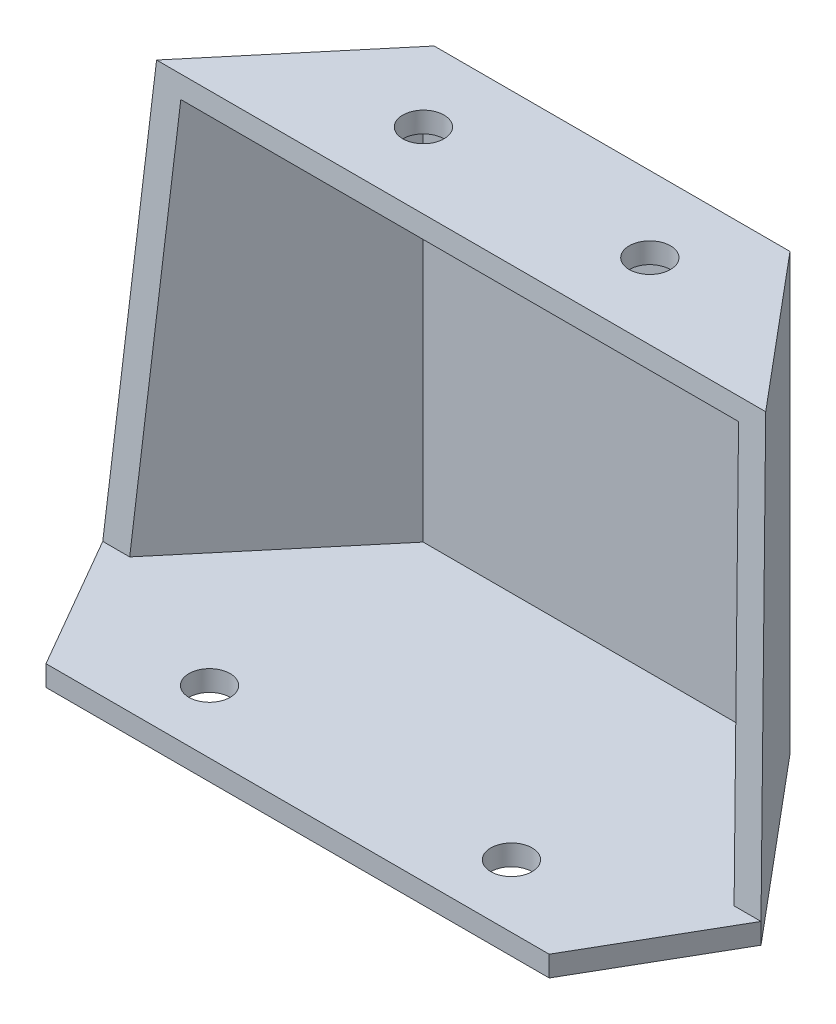
ISO-10303-21;
HEADER;
FILE_DESCRIPTION(('STEP AP214'),'2;1');
FILE_NAME('part.step','',(''),(''),'','','');
FILE_SCHEMA(('AUTOMOTIVE_DESIGN { 1 0 10303 214 1 1 1 1 }'));
ENDSEC;
DATA;
#1=APPLICATION_CONTEXT('core data for automotive mechanical design processes');
#2=APPLICATION_PROTOCOL_DEFINITION('international standard','automotive_design',2000,#1);
#3=PRODUCT_CONTEXT('',#1,'mechanical');
#4=PRODUCT('Part','Part','',(#3));
#5=PRODUCT_RELATED_PRODUCT_CATEGORY('part','',(#4));
#6=PRODUCT_DEFINITION_FORMATION('','',#4);
#7=PRODUCT_DEFINITION_CONTEXT('part definition',#1,'design');
#8=PRODUCT_DEFINITION('design','',#6,#7);
#9=PRODUCT_DEFINITION_SHAPE('','',#8);
#10=(LENGTH_UNIT() NAMED_UNIT(*) SI_UNIT(.MILLI.,.METRE.));
#11=(NAMED_UNIT(*) PLANE_ANGLE_UNIT() SI_UNIT($,.RADIAN.));
#12=(NAMED_UNIT(*) SI_UNIT($,.STERADIAN.) SOLID_ANGLE_UNIT());
#13=UNCERTAINTY_MEASURE_WITH_UNIT(LENGTH_MEASURE(1.E-05),#10,'distance_accuracy_value','');
#14=(GEOMETRIC_REPRESENTATION_CONTEXT(3) GLOBAL_UNCERTAINTY_ASSIGNED_CONTEXT((#13)) GLOBAL_UNIT_ASSIGNED_CONTEXT((#10,
#11,#12)) REPRESENTATION_CONTEXT('',''));
#15=CARTESIAN_POINT('',(0.,0.,0.));
#16=DIRECTION('',(0.,0.,1.));
#17=DIRECTION('',(1.,0.,0.));
#18=AXIS2_PLACEMENT_3D('',#15,#16,#17);
#19=CARTESIAN_POINT('',(86.265,211.,29.5161290322579));
#20=DIRECTION('',(0.,0.,1.));
#21=DIRECTION('',(1.,0.,0.));
#22=AXIS2_PLACEMENT_3D('',#19,#20,#21);
#23=PLANE('',#22);
#24=DIRECTION('',(-1.,0.,0.));
#25=VECTOR('',#24,1.);
#26=CARTESIAN_POINT('',(86.265,0.,29.5161290322579));
#27=LINE('',#26,#25);
#28=CARTESIAN_POINT('',(86.265,0.,29.5161290322579));
#29=VERTEX_POINT('',#28);
#30=CARTESIAN_POINT('',(-86.265,0.,29.5161290322579));
#31=VERTEX_POINT('',#30);
#32=EDGE_CURVE('E226',#29,#31,#27,.T.);
#33=ORIENTED_EDGE('',*,*,#32,.T.);
#34=DIRECTION('',(0.,-1.,0.));
#35=VECTOR('',#34,1.);
#36=CARTESIAN_POINT('',(-86.265,211.,29.5161290322579));
#37=LINE('',#36,#35);
#38=CARTESIAN_POINT('',(-86.265,211.,29.5161290322579));
#39=VERTEX_POINT('',#38);
#40=EDGE_CURVE('E178',#39,#31,#37,.T.);
#41=ORIENTED_EDGE('',*,*,#40,.F.);
#42=DIRECTION('',(-1.,0.,0.));
#43=VECTOR('',#42,1.);
#44=CARTESIAN_POINT('',(86.265,211.,29.5161290322579));
#45=LINE('',#44,#43);
#46=CARTESIAN_POINT('',(86.265,211.,29.5161290322579));
#47=VERTEX_POINT('',#46);
#48=EDGE_CURVE('E227',#47,#39,#45,.T.);
#49=ORIENTED_EDGE('',*,*,#48,.F.);
#50=DIRECTION('',(0.,-1.,0.));
#51=VECTOR('',#50,1.);
#52=CARTESIAN_POINT('',(86.265,211.,29.5161290322579));
#53=LINE('',#52,#51);
#54=EDGE_CURVE('E163',#47,#29,#53,.T.);
#55=ORIENTED_EDGE('',*,*,#54,.T.);
#56=EDGE_LOOP('',(#33,#41,#49,#55));
#57=FACE_BOUND('',#56,.T.);
#58=ADVANCED_FACE('F43',(#57),#23,.F.);
#59=CARTESIAN_POINT('',(-159.592352403093,211.,116.904264694066));
#60=DIRECTION('',(0.766044443118978,0.,0.642787609686539));
#61=DIRECTION('',(0.642787609686539,0.,-0.766044443118978));
#62=AXIS2_PLACEMENT_3D('',#59,#60,#61);
#63=PLANE('',#62);
#64=DIRECTION('',(0.,-1.,0.));
#65=VECTOR('',#64,1.);
#66=CARTESIAN_POINT('',(-159.592352403093,211.,116.904264694066));
#67=LINE('',#66,#65);
#68=CARTESIAN_POINT('',(-159.592352403093,10.,116.904264694066));
#69=VERTEX_POINT('',#68);
#70=CARTESIAN_POINT('',(-159.592352403093,0.,116.904264694066));
#71=VERTEX_POINT('',#70);
#72=EDGE_CURVE('E175',#69,#71,#67,.T.);
#73=ORIENTED_EDGE('',*,*,#72,.F.);
#74=DIRECTION('',(0.0589802795117458,0.995781425892182,-0.0702899600003337));
#75=VECTOR('',#74,1.);
#76=CARTESIAN_POINT('',(-147.787327569917,209.307710278525,102.835583938464));
#77=LINE('',#76,#75);
#78=CARTESIAN_POINT('',(-147.687093002177,211.,102.716129032258));
#79=VERTEX_POINT('',#78);
#80=EDGE_CURVE('E139',#69,#79,#77,.T.);
#81=ORIENTED_EDGE('',*,*,#80,.T.);
#82=DIRECTION('',(-0.64278760968654,0.,0.766044443118978));
#83=VECTOR('',#82,1.);
#84=CARTESIAN_POINT('',(-159.592352403093,211.,116.904264694066));
#85=LINE('',#84,#83);
#86=EDGE_CURVE('E231',#39,#79,#85,.T.);
#87=ORIENTED_EDGE('',*,*,#86,.F.);
#88=ORIENTED_EDGE('',*,*,#40,.T.);
#89=DIRECTION('',(-0.64278760968654,0.,0.766044443118978));
#90=VECTOR('',#89,1.);
#91=CARTESIAN_POINT('',(-159.592352403093,0.,116.904264694066));
#92=LINE('',#91,#90);
#93=EDGE_CURVE('E241',#31,#71,#92,.T.);
#94=ORIENTED_EDGE('',*,*,#93,.T.);
#95=EDGE_LOOP('',(#73,#81,#87,#88,#94));
#96=FACE_BOUND('',#95,.T.);
#97=ADVANCED_FACE('F265',(#96),#63,.F.);
#98=CARTESIAN_POINT('',(-122.,211.,182.016129032258));
#99=DIRECTION('',(0.866025403784438,0.,-0.500000000000002));
#100=DIRECTION('',(-0.500000000000002,0.,-0.866025403784438));
#101=AXIS2_PLACEMENT_3D('',#98,#99,#100);
#102=PLANE('',#101);
#103=DIRECTION('',(0.,-1.,0.));
#104=VECTOR('',#103,1.);
#105=CARTESIAN_POINT('',(-122.,211.,182.016129032258));
#106=LINE('',#105,#104);
#107=CARTESIAN_POINT('',(-122.,10.,182.016129032258));
#108=VERTEX_POINT('',#107);
#109=CARTESIAN_POINT('',(-122.,0.,182.016129032258));
#110=VERTEX_POINT('',#109);
#111=EDGE_CURVE('E167',#108,#110,#106,.T.);
#112=ORIENTED_EDGE('',*,*,#111,.F.);
#113=DIRECTION('',(-0.500000000000002,0.,-0.866025403784438));
#114=VECTOR('',#113,1.);
#115=CARTESIAN_POINT('',(-122.,10.,182.016129032258));
#116=LINE('',#115,#114);
#117=EDGE_CURVE('E138',#108,#69,#116,.T.);
#118=ORIENTED_EDGE('',*,*,#117,.T.);
#119=ORIENTED_EDGE('',*,*,#72,.T.);
#120=DIRECTION('',(0.500000000000002,0.,0.866025403784438));
#121=VECTOR('',#120,1.);
#122=CARTESIAN_POINT('',(-122.,0.,182.016129032258));
#123=LINE('',#122,#121);
#124=EDGE_CURVE('E245',#71,#110,#123,.T.);
#125=ORIENTED_EDGE('',*,*,#124,.T.);
#126=EDGE_LOOP('',(#112,#118,#119,#125));
#127=FACE_BOUND('',#126,.T.);
#128=ADVANCED_FACE('F296',(#127),#102,.F.);
#129=CARTESIAN_POINT('',(-122.,211.,182.016129032258));
#130=DIRECTION('',(0.,0.,-1.));
#131=DIRECTION('',(-1.,0.,0.));
#132=AXIS2_PLACEMENT_3D('',#129,#130,#131);
#133=PLANE('',#132);
#134=DIRECTION('',(0.,-1.,0.));
#135=VECTOR('',#134,1.);
#136=CARTESIAN_POINT('',(122.,211.,182.016129032258));
#137=LINE('',#136,#135);
#138=CARTESIAN_POINT('',(122.,10.,182.016129032258));
#139=VERTEX_POINT('',#138);
#140=CARTESIAN_POINT('',(122.,0.,182.016129032258));
#141=VERTEX_POINT('',#140);
#142=EDGE_CURVE('E162',#139,#141,#137,.T.);
#143=ORIENTED_EDGE('',*,*,#142,.F.);
#144=DIRECTION('',(1.,0.,0.));
#145=VECTOR('',#144,1.);
#146=CARTESIAN_POINT('',(-159.592352403093,10.,182.016129032258));
#147=LINE('',#146,#145);
#148=EDGE_CURVE('E133',#108,#139,#147,.T.);
#149=ORIENTED_EDGE('',*,*,#148,.F.);
#150=ORIENTED_EDGE('',*,*,#111,.T.);
#151=DIRECTION('',(1.,0.,0.));
#152=VECTOR('',#151,1.);
#153=CARTESIAN_POINT('',(-122.,0.,182.016129032258));
#154=LINE('',#153,#152);
#155=EDGE_CURVE('E249',#110,#141,#154,.T.);
#156=ORIENTED_EDGE('',*,*,#155,.T.);
#157=EDGE_LOOP('',(#143,#149,#150,#156));
#158=FACE_BOUND('',#157,.T.);
#159=ADVANCED_FACE('F433',(#158),#133,.F.);
#160=CARTESIAN_POINT('',(122.,211.,182.016129032258));
#161=DIRECTION('',(-0.866025403784438,0.,-0.500000000000001));
#162=DIRECTION('',(-0.500000000000001,0.,0.866025403784438));
#163=AXIS2_PLACEMENT_3D('',#160,#161,#162);
#164=PLANE('',#163);
#165=DIRECTION('',(0.,-1.,0.));
#166=VECTOR('',#165,1.);
#167=CARTESIAN_POINT('',(159.592352403094,211.,116.904264694066));
#168=LINE('',#167,#166);
#169=CARTESIAN_POINT('',(159.592352403094,10.,116.904264694066));
#170=VERTEX_POINT('',#169);
#171=CARTESIAN_POINT('',(159.592352403094,0.,116.904264694066));
#172=VERTEX_POINT('',#171);
#173=EDGE_CURVE('E151',#170,#172,#168,.T.);
#174=ORIENTED_EDGE('',*,*,#173,.F.);
#175=DIRECTION('',(-0.500000000000001,0.,0.866025403784438));
#176=VECTOR('',#175,1.);
#177=CARTESIAN_POINT('',(122.,10.,182.016129032258));
#178=LINE('',#177,#176);
#179=EDGE_CURVE('E128',#170,#139,#178,.T.);
#180=ORIENTED_EDGE('',*,*,#179,.T.);
#181=ORIENTED_EDGE('',*,*,#142,.T.);
#182=DIRECTION('',(0.500000000000001,0.,-0.866025403784438));
#183=VECTOR('',#182,1.);
#184=CARTESIAN_POINT('',(122.,0.,182.016129032258));
#185=LINE('',#184,#183);
#186=EDGE_CURVE('E159',#141,#172,#185,.T.);
#187=ORIENTED_EDGE('',*,*,#186,.T.);
#188=EDGE_LOOP('',(#174,#180,#181,#187));
#189=FACE_BOUND('',#188,.T.);
#190=ADVANCED_FACE('F157',(#189),#164,.F.);
#191=CARTESIAN_POINT('',(159.592352403094,211.,116.904264694066));
#192=DIRECTION('',(-0.766044443118977,0.,0.64278760968654));
#193=DIRECTION('',(0.64278760968654,0.,0.766044443118977));
#194=AXIS2_PLACEMENT_3D('',#191,#192,#193);
#195=PLANE('',#194);
#196=DIRECTION('',(-0.64278760968654,0.,-0.766044443118977));
#197=VECTOR('',#196,1.);
#198=CARTESIAN_POINT('',(159.592352403094,211.,116.904264694066));
#199=LINE('',#198,#197);
#200=CARTESIAN_POINT('',(147.687093002177,211.,102.716129032258));
#201=VERTEX_POINT('',#200);
#202=EDGE_CURVE('E154',#201,#47,#199,.T.);
#203=ORIENTED_EDGE('',*,*,#202,.F.);
#204=DIRECTION('',(0.0589802795117459,-0.995781425892182,0.0702899600003337));
#205=VECTOR('',#204,1.);
#206=CARTESIAN_POINT('',(147.787327569917,209.307710278525,102.835583938464));
#207=LINE('',#206,#205);
#208=EDGE_CURVE('E61',#201,#170,#207,.T.);
#209=ORIENTED_EDGE('',*,*,#208,.T.);
#210=ORIENTED_EDGE('',*,*,#173,.T.);
#211=DIRECTION('',(-0.64278760968654,0.,-0.766044443118977));
#212=VECTOR('',#211,1.);
#213=CARTESIAN_POINT('',(159.592352403094,0.,116.904264694066));
#214=LINE('',#213,#212);
#215=EDGE_CURVE('E232',#172,#29,#214,.T.);
#216=ORIENTED_EDGE('',*,*,#215,.T.);
#217=ORIENTED_EDGE('',*,*,#54,.F.);
#218=EDGE_LOOP('',(#203,#209,#210,#216,#217));
#219=FACE_BOUND('',#218,.T.);
#220=ADVANCED_FACE('F150',(#219),#195,.F.);
#221=CARTESIAN_POINT('',(0.,211.,0.));
#222=DIRECTION('',(0.,-1.,0.));
#223=DIRECTION('',(0.,0.,-1.));
#224=AXIS2_PLACEMENT_3D('',#221,#222,#223);
#225=PLANE('',#224);
#226=CARTESIAN_POINT('',(-54.9,211.,66.1161290322579));
#227=DIRECTION('',(0.,1.,0.));
#228=DIRECTION('',(0.,0.,1.));
#229=AXIS2_PLACEMENT_3D('',#226,#227,#228);
#230=CIRCLE('',#229,10.);
#231=CARTESIAN_POINT('',(-54.9,211.,76.1161290322579));
#232=VERTEX_POINT('',#231);
#233=EDGE_CURVE('E146',#232,#232,#230,.T.);
#234=ORIENTED_EDGE('',*,*,#233,.F.);
#235=EDGE_LOOP('',(#234));
#236=FACE_BOUND('',#235,.T.);
#237=CARTESIAN_POINT('',(54.9,211.,66.1161290322579));
#238=DIRECTION('',(0.,1.,0.));
#239=DIRECTION('',(0.,0.,-1.));
#240=AXIS2_PLACEMENT_3D('',#237,#238,#239);
#241=CIRCLE('',#240,9.99999999999999);
#242=CARTESIAN_POINT('',(54.9,211.,56.1161290322579));
#243=VERTEX_POINT('',#242);
#244=EDGE_CURVE('E488',#243,#243,#241,.T.);
#245=ORIENTED_EDGE('',*,*,#244,.F.);
#246=EDGE_LOOP('',(#245));
#247=FACE_BOUND('',#246,.T.);
#248=ORIENTED_EDGE('',*,*,#86,.T.);
#249=DIRECTION('',(1.,0.,0.));
#250=VECTOR('',#249,1.);
#251=CARTESIAN_POINT('',(-159.592352403093,211.,102.716129032258));
#252=LINE('',#251,#250);
#253=EDGE_CURVE('E268',#79,#201,#252,.T.);
#254=ORIENTED_EDGE('',*,*,#253,.T.);
#255=ORIENTED_EDGE('',*,*,#202,.T.);
#256=ORIENTED_EDGE('',*,*,#48,.T.);
#257=EDGE_LOOP('',(#248,#254,#255,#256));
#258=FACE_BOUND('',#257,.T.);
#259=ADVANCED_FACE('F267',(#236,#247,#258),#225,.F.);
#260=CARTESIAN_POINT('',(0.,0.,0.));
#261=DIRECTION('',(0.,-1.,0.));
#262=DIRECTION('',(0.,0.,-1.));
#263=AXIS2_PLACEMENT_3D('',#260,#261,#262);
#264=PLANE('',#263);
#265=CARTESIAN_POINT('',(-73.2,0.,151.516129032258));
#266=DIRECTION('',(0.,-1.,0.));
#267=DIRECTION('',(0.,0.,-1.));
#268=AXIS2_PLACEMENT_3D('',#265,#266,#267);
#269=CIRCLE('',#268,10.);
#270=CARTESIAN_POINT('',(-73.2,0.,141.516129032258));
#271=VERTEX_POINT('',#270);
#272=EDGE_CURVE('E483',#271,#271,#269,.F.);
#273=ORIENTED_EDGE('',*,*,#272,.T.);
#274=EDGE_LOOP('',(#273));
#275=FACE_BOUND('',#274,.T.);
#276=CARTESIAN_POINT('',(73.2,0.,151.516129032258));
#277=DIRECTION('',(0.,-1.,0.));
#278=DIRECTION('',(0.,0.,-1.));
#279=AXIS2_PLACEMENT_3D('',#276,#277,#278);
#280=CIRCLE('',#279,10.);
#281=CARTESIAN_POINT('',(73.2,0.,141.516129032258));
#282=VERTEX_POINT('',#281);
#283=EDGE_CURVE('E495',#282,#282,#280,.F.);
#284=ORIENTED_EDGE('',*,*,#283,.T.);
#285=EDGE_LOOP('',(#284));
#286=FACE_BOUND('',#285,.T.);
#287=ORIENTED_EDGE('',*,*,#32,.F.);
#288=ORIENTED_EDGE('',*,*,#215,.F.);
#289=ORIENTED_EDGE('',*,*,#186,.F.);
#290=ORIENTED_EDGE('',*,*,#155,.F.);
#291=ORIENTED_EDGE('',*,*,#124,.F.);
#292=ORIENTED_EDGE('',*,*,#93,.F.);
#293=EDGE_LOOP('',(#287,#288,#289,#290,#291,#292));
#294=FACE_BOUND('',#293,.T.);
#295=ADVANCED_FACE('F260',(#275,#286,#294),#264,.T.);
#296=CARTESIAN_POINT('',(-159.592352403093,10.,116.904264694066));
#297=DIRECTION('',(0.,-0.0704125378053743,-0.997517956991155));
#298=DIRECTION('',(0.,0.997517956991155,-0.0704125378053743));
#299=AXIS2_PLACEMENT_3D('',#296,#297,#298);
#300=PLANE('',#299);
#301=DIRECTION('',(1.,0.,0.));
#302=VECTOR('',#301,1.);
#303=CARTESIAN_POINT('',(-159.592352403093,10.,116.904264694066));
#304=LINE('',#303,#302);
#305=CARTESIAN_POINT('',(-146.538279509771,10.,116.904264694066));
#306=VERTEX_POINT('',#305);
#307=EDGE_CURVE('E145',#69,#306,#304,.T.);
#308=ORIENTED_EDGE('',*,*,#307,.T.);
#309=DIRECTION('',(0.0589802795117458,0.995781425892182,-0.0702899600003337));
#310=VECTOR('',#309,1.);
#311=CARTESIAN_POINT('',(-134.778665532355,208.541025429372,102.889702488959));
#312=LINE('',#311,#310);
#313=CARTESIAN_POINT('',(-135.225321571586,201.,103.422006428368));
#314=VERTEX_POINT('',#313);
#315=EDGE_CURVE('E68',#306,#314,#312,.T.);
#316=ORIENTED_EDGE('',*,*,#315,.T.);
#317=DIRECTION('',(1.,0.,0.));
#318=VECTOR('',#317,1.);
#319=CARTESIAN_POINT('',(0.,201.,103.422006428368));
#320=LINE('',#319,#318);
#321=CARTESIAN_POINT('',(135.225321571586,201.,103.422006428368));
#322=VERTEX_POINT('',#321);
#323=EDGE_CURVE('E216',#314,#322,#320,.T.);
#324=ORIENTED_EDGE('',*,*,#323,.T.);
#325=DIRECTION('',(0.0589802795117459,-0.995781425892182,0.0702899600003337));
#326=VECTOR('',#325,1.);
#327=CARTESIAN_POINT('',(134.778665532355,208.541025429372,102.889702488959));
#328=LINE('',#327,#326);
#329=CARTESIAN_POINT('',(146.538279509771,10.,116.904264694066));
#330=VERTEX_POINT('',#329);
#331=EDGE_CURVE('E143',#322,#330,#328,.T.);
#332=ORIENTED_EDGE('',*,*,#331,.T.);
#333=EDGE_CURVE('E130',#330,#170,#304,.T.);
#334=ORIENTED_EDGE('',*,*,#333,.T.);
#335=ORIENTED_EDGE('',*,*,#208,.F.);
#336=ORIENTED_EDGE('',*,*,#253,.F.);
#337=ORIENTED_EDGE('',*,*,#80,.F.);
#338=EDGE_LOOP('',(#308,#316,#324,#332,#334,#335,#336,#337));
#339=FACE_BOUND('',#338,.T.);
#340=ADVANCED_FACE('F141',(#339),#300,.F.);
#341=CARTESIAN_POINT('',(86.265,211.,39.5161290322579));
#342=DIRECTION('',(0.,0.,1.));
#343=DIRECTION('',(1.,0.,0.));
#344=AXIS2_PLACEMENT_3D('',#341,#342,#343);
#345=PLANE('',#344);
#346=DIRECTION('',(-1.,0.,0.));
#347=VECTOR('',#346,1.);
#348=CARTESIAN_POINT('',(0.,10.,39.5161290322579));
#349=LINE('',#348,#347);
#350=CARTESIAN_POINT('',(81.6019234184501,10.,39.5161290322579));
#351=VERTEX_POINT('',#350);
#352=CARTESIAN_POINT('',(-81.60192341845,10.,39.5161290322579));
#353=VERTEX_POINT('',#352);
#354=EDGE_CURVE('E47',#351,#353,#349,.T.);
#355=ORIENTED_EDGE('',*,*,#354,.F.);
#356=DIRECTION('',(0.,-1.,0.));
#357=VECTOR('',#356,1.);
#358=CARTESIAN_POINT('',(81.6019234184501,211.,39.5161290322579));
#359=LINE('',#358,#357);
#360=CARTESIAN_POINT('',(81.6019234184501,201.,39.5161290322579));
#361=VERTEX_POINT('',#360);
#362=EDGE_CURVE('E198',#361,#351,#359,.T.);
#363=ORIENTED_EDGE('',*,*,#362,.F.);
#364=DIRECTION('',(-1.,0.,0.));
#365=VECTOR('',#364,1.);
#366=CARTESIAN_POINT('',(0.,201.,39.5161290322579));
#367=LINE('',#366,#365);
#368=CARTESIAN_POINT('',(-81.60192341845,201.,39.5161290322579));
#369=VERTEX_POINT('',#368);
#370=EDGE_CURVE('E185',#361,#369,#367,.T.);
#371=ORIENTED_EDGE('',*,*,#370,.T.);
#372=DIRECTION('',(0.,-1.,0.));
#373=VECTOR('',#372,1.);
#374=CARTESIAN_POINT('',(-81.60192341845,211.,39.5161290322579));
#375=LINE('',#374,#373);
#376=EDGE_CURVE('E192',#369,#353,#375,.T.);
#377=ORIENTED_EDGE('',*,*,#376,.T.);
#378=EDGE_LOOP('',(#355,#363,#371,#377));
#379=FACE_BOUND('',#378,.T.);
#380=ADVANCED_FACE('F208',(#379),#345,.T.);
#381=CARTESIAN_POINT('',(-151.931907971904,211.,123.332140790932));
#382=DIRECTION('',(0.766044443118978,0.,0.642787609686539));
#383=DIRECTION('',(0.642787609686539,0.,-0.766044443118978));
#384=AXIS2_PLACEMENT_3D('',#381,#382,#383);
#385=PLANE('',#384);
#386=ORIENTED_EDGE('',*,*,#315,.F.);
#387=DIRECTION('',(-0.642787609686539,0.,0.766044443118978));
#388=VECTOR('',#387,1.);
#389=CARTESIAN_POINT('',(-28.428079237091,10.,-23.8539908029215));
#390=LINE('',#389,#388);
#391=EDGE_CURVE('E196',#353,#306,#390,.T.);
#392=ORIENTED_EDGE('',*,*,#391,.F.);
#393=ORIENTED_EDGE('',*,*,#376,.F.);
#394=DIRECTION('',(-0.642787609686539,0.,0.766044443118978));
#395=VECTOR('',#394,1.);
#396=CARTESIAN_POINT('',(-28.428079237091,201.,-23.8539908029215));
#397=LINE('',#396,#395);
#398=EDGE_CURVE('E53',#369,#314,#397,.T.);
#399=ORIENTED_EDGE('',*,*,#398,.T.);
#400=EDGE_LOOP('',(#386,#392,#393,#399));
#401=FACE_BOUND('',#400,.T.);
#402=ADVANCED_FACE('F212',(#401),#385,.T.);
#403=CARTESIAN_POINT('',(151.931907971904,211.,123.332140790931));
#404=DIRECTION('',(-0.766044443118977,0.,0.64278760968654));
#405=DIRECTION('',(0.64278760968654,0.,0.766044443118977));
#406=AXIS2_PLACEMENT_3D('',#403,#404,#405);
#407=PLANE('',#406);
#408=ORIENTED_EDGE('',*,*,#331,.F.);
#409=DIRECTION('',(-0.64278760968654,0.,-0.766044443118977));
#410=VECTOR('',#409,1.);
#411=CARTESIAN_POINT('',(28.4280792370909,201.,-23.8539908029215));
#412=LINE('',#411,#410);
#413=EDGE_CURVE('E11',#322,#361,#412,.T.);
#414=ORIENTED_EDGE('',*,*,#413,.T.);
#415=ORIENTED_EDGE('',*,*,#362,.T.);
#416=DIRECTION('',(-0.64278760968654,0.,-0.766044443118977));
#417=VECTOR('',#416,1.);
#418=CARTESIAN_POINT('',(28.4280792370909,10.,-23.8539908029215));
#419=LINE('',#418,#417);
#420=EDGE_CURVE('E189',#330,#351,#419,.T.);
#421=ORIENTED_EDGE('',*,*,#420,.F.);
#422=EDGE_LOOP('',(#408,#414,#415,#421));
#423=FACE_BOUND('',#422,.T.);
#424=ADVANCED_FACE('F278',(#423),#407,.T.);
#425=CARTESIAN_POINT('',(0.,201.,0.));
#426=DIRECTION('',(0.,-1.,0.));
#427=DIRECTION('',(0.,0.,-1.));
#428=AXIS2_PLACEMENT_3D('',#425,#426,#427);
#429=PLANE('',#428);
#430=CARTESIAN_POINT('',(-54.9,201.,66.1161290322579));
#431=DIRECTION('',(0.,-1.,0.));
#432=DIRECTION('',(0.,0.,-1.));
#433=AXIS2_PLACEMENT_3D('',#430,#431,#432);
#434=CIRCLE('',#433,10.);
#435=CARTESIAN_POINT('',(-54.9,201.,56.1161290322579));
#436=VERTEX_POINT('',#435);
#437=EDGE_CURVE('E505',#436,#436,#434,.F.);
#438=ORIENTED_EDGE('',*,*,#437,.T.);
#439=EDGE_LOOP('',(#438));
#440=FACE_BOUND('',#439,.T.);
#441=CARTESIAN_POINT('',(54.9,201.,66.1161290322579));
#442=DIRECTION('',(0.,-1.,0.));
#443=DIRECTION('',(0.,0.,-1.));
#444=AXIS2_PLACEMENT_3D('',#441,#442,#443);
#445=CIRCLE('',#444,9.99999999999999);
#446=CARTESIAN_POINT('',(54.9,201.,56.1161290322579));
#447=VERTEX_POINT('',#446);
#448=EDGE_CURVE('E493',#447,#447,#445,.F.);
#449=ORIENTED_EDGE('',*,*,#448,.T.);
#450=EDGE_LOOP('',(#449));
#451=FACE_BOUND('',#450,.T.);
#452=ORIENTED_EDGE('',*,*,#323,.F.);
#453=ORIENTED_EDGE('',*,*,#398,.F.);
#454=ORIENTED_EDGE('',*,*,#370,.F.);
#455=ORIENTED_EDGE('',*,*,#413,.F.);
#456=EDGE_LOOP('',(#452,#453,#454,#455));
#457=FACE_BOUND('',#456,.T.);
#458=ADVANCED_FACE('F279',(#440,#451,#457),#429,.T.);
#459=CARTESIAN_POINT('',(0.,10.,0.));
#460=DIRECTION('',(0.,-1.,0.));
#461=DIRECTION('',(0.,0.,-1.));
#462=AXIS2_PLACEMENT_3D('',#459,#460,#461);
#463=PLANE('',#462);
#464=CARTESIAN_POINT('',(-73.2,10.,151.516129032258));
#465=DIRECTION('',(0.,1.,0.));
#466=DIRECTION('',(0.,0.,1.));
#467=AXIS2_PLACEMENT_3D('',#464,#465,#466);
#468=CIRCLE('',#467,10.);
#469=CARTESIAN_POINT('',(-73.2,10.,161.516129032258));
#470=VERTEX_POINT('',#469);
#471=EDGE_CURVE('E486',#470,#470,#468,.T.);
#472=ORIENTED_EDGE('',*,*,#471,.F.);
#473=EDGE_LOOP('',(#472));
#474=FACE_BOUND('',#473,.T.);
#475=CARTESIAN_POINT('',(73.2,10.,151.516129032258));
#476=DIRECTION('',(0.,1.,0.));
#477=DIRECTION('',(0.,0.,-1.));
#478=AXIS2_PLACEMENT_3D('',#475,#476,#477);
#479=CIRCLE('',#478,10.);
#480=CARTESIAN_POINT('',(73.2,10.,141.516129032258));
#481=VERTEX_POINT('',#480);
#482=EDGE_CURVE('E501',#481,#481,#479,.T.);
#483=ORIENTED_EDGE('',*,*,#482,.F.);
#484=EDGE_LOOP('',(#483));
#485=FACE_BOUND('',#484,.T.);
#486=ORIENTED_EDGE('',*,*,#391,.T.);
#487=ORIENTED_EDGE('',*,*,#307,.F.);
#488=ORIENTED_EDGE('',*,*,#117,.F.);
#489=ORIENTED_EDGE('',*,*,#148,.T.);
#490=ORIENTED_EDGE('',*,*,#179,.F.);
#491=ORIENTED_EDGE('',*,*,#333,.F.);
#492=ORIENTED_EDGE('',*,*,#420,.T.);
#493=ORIENTED_EDGE('',*,*,#354,.T.);
#494=EDGE_LOOP('',(#486,#487,#488,#489,#490,#491,#492,#493));
#495=FACE_BOUND('',#494,.T.);
#496=ADVANCED_FACE('F45',(#474,#485,#495),#463,.F.);
#497=CARTESIAN_POINT('',(54.9,-0.001000000000001,66.1161290322579));
#498=DIRECTION('',(0.,1.,0.));
#499=DIRECTION('',(0.,0.,1.));
#500=AXIS2_PLACEMENT_3D('',#497,#498,#499);
#501=CYLINDRICAL_SURFACE('',#500,9.99999999999999);
#502=ORIENTED_EDGE('',*,*,#448,.F.);
#503=EDGE_LOOP('',(#502));
#504=FACE_BOUND('',#503,.T.);
#505=ORIENTED_EDGE('',*,*,#244,.T.);
#506=EDGE_LOOP('',(#505));
#507=FACE_BOUND('',#506,.T.);
#508=ADVANCED_FACE('F286',(#504,#507),#501,.F.);
#509=CARTESIAN_POINT('',(-54.9,-0.001000000000001,66.1161290322579));
#510=DIRECTION('',(0.,1.,0.));
#511=DIRECTION('',(0.,0.,1.));
#512=AXIS2_PLACEMENT_3D('',#509,#510,#511);
#513=CYLINDRICAL_SURFACE('',#512,10.);
#514=ORIENTED_EDGE('',*,*,#437,.F.);
#515=EDGE_LOOP('',(#514));
#516=FACE_BOUND('',#515,.T.);
#517=ORIENTED_EDGE('',*,*,#233,.T.);
#518=EDGE_LOOP('',(#517));
#519=FACE_BOUND('',#518,.T.);
#520=ADVANCED_FACE('F343',(#516,#519),#513,.F.);
#521=CARTESIAN_POINT('',(73.2,-0.000999999999999265,151.516129032258));
#522=DIRECTION('',(0.,1.,0.));
#523=DIRECTION('',(0.,0.,1.));
#524=AXIS2_PLACEMENT_3D('',#521,#522,#523);
#525=CYLINDRICAL_SURFACE('',#524,10.);
#526=ORIENTED_EDGE('',*,*,#283,.F.);
#527=EDGE_LOOP('',(#526));
#528=FACE_BOUND('',#527,.T.);
#529=ORIENTED_EDGE('',*,*,#482,.T.);
#530=EDGE_LOOP('',(#529));
#531=FACE_BOUND('',#530,.T.);
#532=ADVANCED_FACE('F355',(#528,#531),#525,.F.);
#533=CARTESIAN_POINT('',(-73.2,-0.000999999999999265,151.516129032258));
#534=DIRECTION('',(0.,1.,0.));
#535=DIRECTION('',(0.,0.,1.));
#536=AXIS2_PLACEMENT_3D('',#533,#534,#535);
#537=CYLINDRICAL_SURFACE('',#536,10.);
#538=ORIENTED_EDGE('',*,*,#272,.F.);
#539=EDGE_LOOP('',(#538));
#540=FACE_BOUND('',#539,.T.);
#541=ORIENTED_EDGE('',*,*,#471,.T.);
#542=EDGE_LOOP('',(#541));
#543=FACE_BOUND('',#542,.T.);
#544=ADVANCED_FACE('F381',(#540,#543),#537,.F.);
#545=CLOSED_SHELL('',(#58,#97,#128,#159,#190,#220,#259,#295,#340,#380,#402,#424,#458,#496,#508,
#520,#532,#544));
#546=MANIFOLD_SOLID_BREP('B2',#545);
#547=ADVANCED_BREP_SHAPE_REPRESENTATION('',(#18,#546),#14);
#548=SHAPE_DEFINITION_REPRESENTATION(#9,#547);
ENDSEC;
END-ISO-10303-21;
